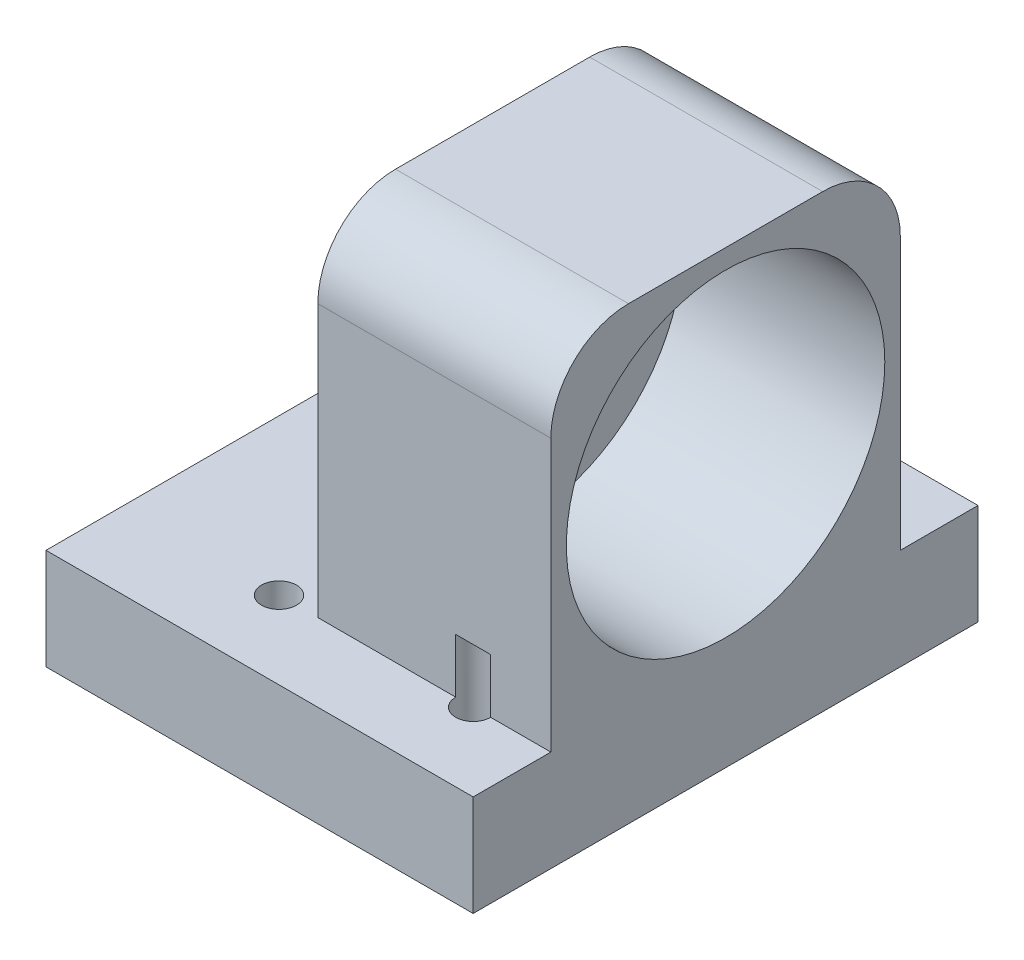
ISO-10303-21;
HEADER;
FILE_DESCRIPTION(('STEP AP214'),'2;1');
FILE_NAME('part.step','',(''),(''),'','','');
FILE_SCHEMA(('AUTOMOTIVE_DESIGN { 1 0 10303 214 1 1 1 1 }'));
ENDSEC;
DATA;
#1=APPLICATION_CONTEXT('core data for automotive mechanical design processes');
#2=APPLICATION_PROTOCOL_DEFINITION('international standard','automotive_design',2000,#1);
#3=PRODUCT_CONTEXT('',#1,'mechanical');
#4=PRODUCT('Part','Part','',(#3));
#5=PRODUCT_RELATED_PRODUCT_CATEGORY('part','',(#4));
#6=PRODUCT_DEFINITION_FORMATION('','',#4);
#7=PRODUCT_DEFINITION_CONTEXT('part definition',#1,'design');
#8=PRODUCT_DEFINITION('design','',#6,#7);
#9=PRODUCT_DEFINITION_SHAPE('','',#8);
#10=(LENGTH_UNIT() NAMED_UNIT(*) SI_UNIT(.MILLI.,.METRE.));
#11=(NAMED_UNIT(*) PLANE_ANGLE_UNIT() SI_UNIT($,.RADIAN.));
#12=(NAMED_UNIT(*) SI_UNIT($,.STERADIAN.) SOLID_ANGLE_UNIT());
#13=UNCERTAINTY_MEASURE_WITH_UNIT(LENGTH_MEASURE(1.E-05),#10,'distance_accuracy_value','');
#14=(GEOMETRIC_REPRESENTATION_CONTEXT(3) GLOBAL_UNCERTAINTY_ASSIGNED_CONTEXT((#13)) GLOBAL_UNIT_ASSIGNED_CONTEXT((#10,
#11,#12)) REPRESENTATION_CONTEXT('',''));
#15=CARTESIAN_POINT('',(0.,0.,0.));
#16=DIRECTION('',(0.,0.,1.));
#17=DIRECTION('',(1.,0.,0.));
#18=AXIS2_PLACEMENT_3D('',#15,#16,#17);
#19=CARTESIAN_POINT('',(22.5,13.,-32.5));
#20=DIRECTION('',(-1.,0.,0.));
#21=DIRECTION('',(0.,0.,1.));
#22=AXIS2_PLACEMENT_3D('',#19,#20,#21);
#23=PLANE('',#22);
#24=CARTESIAN_POINT('',(22.5,35.,0.));
#25=DIRECTION('',(1.,0.,0.));
#26=DIRECTION('',(0.,0.,-1.));
#27=AXIS2_PLACEMENT_3D('',#24,#25,#26);
#28=CIRCLE('',#27,20.5);
#29=CARTESIAN_POINT('',(22.5,35.,-20.5));
#30=VERTEX_POINT('',#29);
#31=EDGE_CURVE('E284',#30,#30,#28,.T.);
#32=ORIENTED_EDGE('',*,*,#31,.F.);
#33=EDGE_LOOP('',(#32));
#34=FACE_BOUND('',#33,.T.);
#35=DIRECTION('',(0.,-1.,0.));
#36=VECTOR('',#35,1.);
#37=CARTESIAN_POINT('',(22.5,63.,-22.5));
#38=LINE('',#37,#36);
#39=CARTESIAN_POINT('',(22.5,48.,-22.5));
#40=VERTEX_POINT('',#39);
#41=CARTESIAN_POINT('',(22.5,13.,-22.5));
#42=VERTEX_POINT('',#41);
#43=EDGE_CURVE('E308',#40,#42,#38,.T.);
#44=ORIENTED_EDGE('',*,*,#43,.F.);
#45=CARTESIAN_POINT('',(22.5,48.,-12.5));
#46=DIRECTION('',(-1.,0.,0.));
#47=DIRECTION('',(0.,0.,1.));
#48=AXIS2_PLACEMENT_3D('',#45,#46,#47);
#49=CIRCLE('',#48,10.);
#50=CARTESIAN_POINT('',(22.5,58.,-12.5));
#51=VERTEX_POINT('',#50);
#52=EDGE_CURVE('E11',#40,#51,#49,.F.);
#53=ORIENTED_EDGE('',*,*,#52,.T.);
#54=DIRECTION('',(0.,0.,-1.));
#55=VECTOR('',#54,1.);
#56=CARTESIAN_POINT('',(22.5,58.,-22.5));
#57=LINE('',#56,#55);
#58=CARTESIAN_POINT('',(22.5,58.,12.5));
#59=VERTEX_POINT('',#58);
#60=EDGE_CURVE('E168',#59,#51,#57,.T.);
#61=ORIENTED_EDGE('',*,*,#60,.F.);
#62=CARTESIAN_POINT('',(22.5,48.,12.5));
#63=DIRECTION('',(-1.,0.,0.));
#64=DIRECTION('',(0.,0.,1.));
#65=AXIS2_PLACEMENT_3D('',#62,#63,#64);
#66=CIRCLE('',#65,10.);
#67=CARTESIAN_POINT('',(22.5,48.,22.5));
#68=VERTEX_POINT('',#67);
#69=EDGE_CURVE('E209',#59,#68,#66,.F.);
#70=ORIENTED_EDGE('',*,*,#69,.T.);
#71=DIRECTION('',(0.,-1.,0.));
#72=VECTOR('',#71,1.);
#73=CARTESIAN_POINT('',(22.5,63.,22.5));
#74=LINE('',#73,#72);
#75=CARTESIAN_POINT('',(22.5,13.,22.5));
#76=VERTEX_POINT('',#75);
#77=EDGE_CURVE('E299',#68,#76,#74,.T.);
#78=ORIENTED_EDGE('',*,*,#77,.T.);
#79=DIRECTION('',(0.,0.,-1.));
#80=VECTOR('',#79,1.);
#81=CARTESIAN_POINT('',(22.5,13.,-32.5));
#82=LINE('',#81,#80);
#83=CARTESIAN_POINT('',(22.5,13.,32.5));
#84=VERTEX_POINT('',#83);
#85=EDGE_CURVE('E320',#84,#76,#82,.T.);
#86=ORIENTED_EDGE('',*,*,#85,.F.);
#87=DIRECTION('',(0.,-1.,0.));
#88=VECTOR('',#87,1.);
#89=CARTESIAN_POINT('',(22.5,13.,32.5));
#90=LINE('',#89,#88);
#91=CARTESIAN_POINT('',(22.5,0.,32.5));
#92=VERTEX_POINT('',#91);
#93=EDGE_CURVE('E343',#84,#92,#90,.T.);
#94=ORIENTED_EDGE('',*,*,#93,.T.);
#95=DIRECTION('',(0.,0.,-1.));
#96=VECTOR('',#95,1.);
#97=CARTESIAN_POINT('',(22.5,0.,-32.5));
#98=LINE('',#97,#96);
#99=CARTESIAN_POINT('',(22.5,0.,-32.5));
#100=VERTEX_POINT('',#99);
#101=EDGE_CURVE('E334',#92,#100,#98,.T.);
#102=ORIENTED_EDGE('',*,*,#101,.T.);
#103=DIRECTION('',(0.,-1.,0.));
#104=VECTOR('',#103,1.);
#105=CARTESIAN_POINT('',(22.5,13.,-32.5));
#106=LINE('',#105,#104);
#107=CARTESIAN_POINT('',(22.5,13.,-32.5));
#108=VERTEX_POINT('',#107);
#109=EDGE_CURVE('E328',#108,#100,#106,.T.);
#110=ORIENTED_EDGE('',*,*,#109,.F.);
#111=EDGE_CURVE('E319',#42,#108,#82,.T.);
#112=ORIENTED_EDGE('',*,*,#111,.F.);
#113=EDGE_LOOP('',(#44,#53,#61,#70,#78,#86,#94,#102,#110,#112));
#114=FACE_BOUND('',#113,.T.);
#115=ADVANCED_FACE('F45',(#34,#114),#23,.F.);
#116=CARTESIAN_POINT('',(22.5,63.,-22.5));
#117=DIRECTION('',(0.,0.,1.));
#118=DIRECTION('',(1.,0.,0.));
#119=AXIS2_PLACEMENT_3D('',#116,#117,#118);
#120=PLANE('',#119);
#121=DIRECTION('',(0.,-1.,0.));
#122=VECTOR('',#121,1.);
#123=CARTESIAN_POINT('',(-7.5,63.,-22.5));
#124=LINE('',#123,#122);
#125=CARTESIAN_POINT('',(-7.5,48.,-22.5));
#126=VERTEX_POINT('',#125);
#127=CARTESIAN_POINT('',(-7.5,13.,-22.5));
#128=VERTEX_POINT('',#127);
#129=EDGE_CURVE('E305',#126,#128,#124,.T.);
#130=ORIENTED_EDGE('',*,*,#129,.F.);
#131=DIRECTION('',(-1.,0.,0.));
#132=VECTOR('',#131,1.);
#133=CARTESIAN_POINT('',(22.5,48.,-22.5));
#134=LINE('',#133,#132);
#135=EDGE_CURVE('E54',#126,#40,#134,.F.);
#136=ORIENTED_EDGE('',*,*,#135,.T.);
#137=ORIENTED_EDGE('',*,*,#43,.T.);
#138=DIRECTION('',(-1.,0.,0.));
#139=VECTOR('',#138,1.);
#140=CARTESIAN_POINT('',(22.5,13.,-22.5));
#141=LINE('',#140,#139);
#142=CARTESIAN_POINT('',(14.75,13.,-22.5));
#143=VERTEX_POINT('',#142);
#144=EDGE_CURVE('E288',#42,#143,#141,.T.);
#145=ORIENTED_EDGE('',*,*,#144,.T.);
#146=DIRECTION('',(0.,-1.,0.));
#147=VECTOR('',#146,1.);
#148=CARTESIAN_POINT('',(14.75,20.,-22.5));
#149=LINE('',#148,#147);
#150=CARTESIAN_POINT('',(14.75,20.,-22.5));
#151=VERTEX_POINT('',#150);
#152=EDGE_CURVE('E184',#143,#151,#149,.F.);
#153=ORIENTED_EDGE('',*,*,#152,.T.);
#154=DIRECTION('',(1.,0.,0.));
#155=VECTOR('',#154,1.);
#156=CARTESIAN_POINT('',(22.5,20.,-22.5));
#157=LINE('',#156,#155);
#158=CARTESIAN_POINT('',(10.25,20.,-22.5));
#159=VERTEX_POINT('',#158);
#160=EDGE_CURVE('E178',#159,#151,#157,.T.);
#161=ORIENTED_EDGE('',*,*,#160,.F.);
#162=DIRECTION('',(0.,-1.,0.));
#163=VECTOR('',#162,1.);
#164=CARTESIAN_POINT('',(10.25,20.,-22.5));
#165=LINE('',#164,#163);
#166=CARTESIAN_POINT('',(10.25,13.,-22.5));
#167=VERTEX_POINT('',#166);
#168=EDGE_CURVE('E188',#159,#167,#165,.T.);
#169=ORIENTED_EDGE('',*,*,#168,.T.);
#170=EDGE_CURVE('E283',#167,#128,#141,.T.);
#171=ORIENTED_EDGE('',*,*,#170,.T.);
#172=EDGE_LOOP('',(#130,#136,#137,#145,#153,#161,#169,#171));
#173=FACE_BOUND('',#172,.T.);
#174=ADVANCED_FACE('F370',(#173),#120,.F.);
#175=CARTESIAN_POINT('',(-7.5,63.,-22.5));
#176=DIRECTION('',(1.,0.,0.));
#177=DIRECTION('',(0.,0.,-1.));
#178=AXIS2_PLACEMENT_3D('',#175,#176,#177);
#179=PLANE('',#178);
#180=CARTESIAN_POINT('',(-7.5,35.,0.));
#181=DIRECTION('',(1.,0.,0.));
#182=DIRECTION('',(0.,0.,-1.));
#183=AXIS2_PLACEMENT_3D('',#180,#181,#182);
#184=CIRCLE('',#183,7.);
#185=CARTESIAN_POINT('',(-7.5,35.,-7.));
#186=VERTEX_POINT('',#185);
#187=EDGE_CURVE('E278',#186,#186,#184,.T.);
#188=ORIENTED_EDGE('',*,*,#187,.T.);
#189=EDGE_LOOP('',(#188));
#190=FACE_BOUND('',#189,.T.);
#191=DIRECTION('',(0.,0.,1.));
#192=VECTOR('',#191,1.);
#193=CARTESIAN_POINT('',(-7.5,58.,-22.5));
#194=LINE('',#193,#192);
#195=CARTESIAN_POINT('',(-7.5,58.,-12.5));
#196=VERTEX_POINT('',#195);
#197=CARTESIAN_POINT('',(-7.5,58.,12.5));
#198=VERTEX_POINT('',#197);
#199=EDGE_CURVE('E229',#196,#198,#194,.T.);
#200=ORIENTED_EDGE('',*,*,#199,.F.);
#201=CARTESIAN_POINT('',(-7.5,48.,-12.5));
#202=DIRECTION('',(1.,0.,0.));
#203=DIRECTION('',(0.,0.,-1.));
#204=AXIS2_PLACEMENT_3D('',#201,#202,#203);
#205=CIRCLE('',#204,10.);
#206=EDGE_CURVE('E68',#196,#126,#205,.F.);
#207=ORIENTED_EDGE('',*,*,#206,.T.);
#208=ORIENTED_EDGE('',*,*,#129,.T.);
#209=DIRECTION('',(0.,0.,1.));
#210=VECTOR('',#209,1.);
#211=CARTESIAN_POINT('',(-7.5,13.,-22.5));
#212=LINE('',#211,#210);
#213=CARTESIAN_POINT('',(-7.49999999999999,13.,22.5));
#214=VERTEX_POINT('',#213);
#215=EDGE_CURVE('E292',#128,#214,#212,.T.);
#216=ORIENTED_EDGE('',*,*,#215,.T.);
#217=DIRECTION('',(0.,-1.,0.));
#218=VECTOR('',#217,1.);
#219=CARTESIAN_POINT('',(-7.49999999999999,63.,22.5));
#220=LINE('',#219,#218);
#221=CARTESIAN_POINT('',(-7.49999999999999,48.,22.5));
#222=VERTEX_POINT('',#221);
#223=EDGE_CURVE('E302',#222,#214,#220,.T.);
#224=ORIENTED_EDGE('',*,*,#223,.F.);
#225=CARTESIAN_POINT('',(-7.49999999999999,48.,12.5));
#226=DIRECTION('',(1.,0.,0.));
#227=DIRECTION('',(0.,0.,-1.));
#228=AXIS2_PLACEMENT_3D('',#225,#226,#227);
#229=CIRCLE('',#228,10.);
#230=EDGE_CURVE('E215',#222,#198,#229,.F.);
#231=ORIENTED_EDGE('',*,*,#230,.T.);
#232=EDGE_LOOP('',(#200,#207,#208,#216,#224,#231));
#233=FACE_BOUND('',#232,.T.);
#234=ADVANCED_FACE('F233',(#190,#233),#179,.F.);
#235=CARTESIAN_POINT('',(22.5,63.,22.5));
#236=DIRECTION('',(0.,0.,-1.));
#237=DIRECTION('',(-1.,0.,0.));
#238=AXIS2_PLACEMENT_3D('',#235,#236,#237);
#239=PLANE('',#238);
#240=ORIENTED_EDGE('',*,*,#77,.F.);
#241=DIRECTION('',(1.,0.,0.));
#242=VECTOR('',#241,1.);
#243=CARTESIAN_POINT('',(-7.49999999999999,48.,22.5));
#244=LINE('',#243,#242);
#245=EDGE_CURVE('E212',#68,#222,#244,.F.);
#246=ORIENTED_EDGE('',*,*,#245,.T.);
#247=ORIENTED_EDGE('',*,*,#223,.T.);
#248=DIRECTION('',(1.,0.,0.));
#249=VECTOR('',#248,1.);
#250=CARTESIAN_POINT('',(22.5,13.,22.5));
#251=LINE('',#250,#249);
#252=CARTESIAN_POINT('',(10.25,13.,22.5));
#253=VERTEX_POINT('',#252);
#254=EDGE_CURVE('E174',#214,#253,#251,.T.);
#255=ORIENTED_EDGE('',*,*,#254,.T.);
#256=DIRECTION('',(0.,-1.,0.));
#257=VECTOR('',#256,1.);
#258=CARTESIAN_POINT('',(10.25,20.,22.5));
#259=LINE('',#258,#257);
#260=CARTESIAN_POINT('',(10.25,20.,22.5));
#261=VERTEX_POINT('',#260);
#262=EDGE_CURVE('E159',#253,#261,#259,.F.);
#263=ORIENTED_EDGE('',*,*,#262,.T.);
#264=DIRECTION('',(-1.,0.,0.));
#265=VECTOR('',#264,1.);
#266=CARTESIAN_POINT('',(22.5,20.,22.5));
#267=LINE('',#266,#265);
#268=CARTESIAN_POINT('',(14.75,20.,22.5));
#269=VERTEX_POINT('',#268);
#270=EDGE_CURVE('E150',#269,#261,#267,.T.);
#271=ORIENTED_EDGE('',*,*,#270,.F.);
#272=DIRECTION('',(0.,-1.,0.));
#273=VECTOR('',#272,1.);
#274=CARTESIAN_POINT('',(14.75,20.,22.5));
#275=LINE('',#274,#273);
#276=CARTESIAN_POINT('',(14.75,13.,22.5));
#277=VERTEX_POINT('',#276);
#278=EDGE_CURVE('E165',#269,#277,#275,.T.);
#279=ORIENTED_EDGE('',*,*,#278,.T.);
#280=EDGE_CURVE('E296',#277,#76,#251,.T.);
#281=ORIENTED_EDGE('',*,*,#280,.T.);
#282=EDGE_LOOP('',(#240,#246,#247,#255,#263,#271,#279,#281));
#283=FACE_BOUND('',#282,.T.);
#284=ADVANCED_FACE('F172',(#283),#239,.F.);
#285=CARTESIAN_POINT('',(-32.5,13.,-32.5));
#286=DIRECTION('',(1.,0.,0.));
#287=DIRECTION('',(0.,0.,-1.));
#288=AXIS2_PLACEMENT_3D('',#285,#286,#287);
#289=PLANE('',#288);
#290=DIRECTION('',(0.,0.,1.));
#291=VECTOR('',#290,1.);
#292=CARTESIAN_POINT('',(-32.5,13.,-32.5));
#293=LINE('',#292,#291);
#294=CARTESIAN_POINT('',(-32.5,13.,-22.5));
#295=VERTEX_POINT('',#294);
#296=CARTESIAN_POINT('',(-32.5,13.,32.5));
#297=VERTEX_POINT('',#296);
#298=EDGE_CURVE('E312',#295,#297,#293,.T.);
#299=ORIENTED_EDGE('',*,*,#298,.F.);
#300=DIRECTION('',(0.,-1.,0.));
#301=VECTOR('',#300,1.);
#302=CARTESIAN_POINT('',(-32.5,13.,-22.5));
#303=LINE('',#302,#301);
#304=CARTESIAN_POINT('',(-32.5,0.,-22.5));
#305=VERTEX_POINT('',#304);
#306=EDGE_CURVE('E192',#295,#305,#303,.T.);
#307=ORIENTED_EDGE('',*,*,#306,.T.);
#308=DIRECTION('',(0.,0.,1.));
#309=VECTOR('',#308,1.);
#310=CARTESIAN_POINT('',(-32.5,0.,-32.5));
#311=LINE('',#310,#309);
#312=CARTESIAN_POINT('',(-32.5,0.,32.5));
#313=VERTEX_POINT('',#312);
#314=EDGE_CURVE('E311',#305,#313,#311,.T.);
#315=ORIENTED_EDGE('',*,*,#314,.T.);
#316=DIRECTION('',(0.,-1.,0.));
#317=VECTOR('',#316,1.);
#318=CARTESIAN_POINT('',(-32.5,13.,32.5));
#319=LINE('',#318,#317);
#320=EDGE_CURVE('E160',#297,#313,#319,.T.);
#321=ORIENTED_EDGE('',*,*,#320,.F.);
#322=EDGE_LOOP('',(#299,#307,#315,#321));
#323=FACE_BOUND('',#322,.T.);
#324=ADVANCED_FACE('F387',(#323),#289,.F.);
#325=CARTESIAN_POINT('',(-32.5,13.,32.5));
#326=DIRECTION('',(0.,0.,-1.));
#327=DIRECTION('',(-1.,0.,0.));
#328=AXIS2_PLACEMENT_3D('',#325,#326,#327);
#329=PLANE('',#328);
#330=DIRECTION('',(1.,0.,0.));
#331=VECTOR('',#330,1.);
#332=CARTESIAN_POINT('',(-32.5,0.,32.5));
#333=LINE('',#332,#331);
#334=EDGE_CURVE('E331',#313,#92,#333,.T.);
#335=ORIENTED_EDGE('',*,*,#334,.T.);
#336=ORIENTED_EDGE('',*,*,#93,.F.);
#337=DIRECTION('',(1.,0.,0.));
#338=VECTOR('',#337,1.);
#339=CARTESIAN_POINT('',(-32.5,13.,32.5));
#340=LINE('',#339,#338);
#341=EDGE_CURVE('E315',#297,#84,#340,.T.);
#342=ORIENTED_EDGE('',*,*,#341,.F.);
#343=ORIENTED_EDGE('',*,*,#320,.T.);
#344=EDGE_LOOP('',(#335,#336,#342,#343));
#345=FACE_BOUND('',#344,.T.);
#346=ADVANCED_FACE('F384',(#345),#329,.F.);
#347=CARTESIAN_POINT('',(-32.5,13.,-32.5));
#348=DIRECTION('',(0.,0.,1.));
#349=DIRECTION('',(1.,0.,0.));
#350=AXIS2_PLACEMENT_3D('',#347,#348,#349);
#351=PLANE('',#350);
#352=DIRECTION('',(-1.,0.,0.));
#353=VECTOR('',#352,1.);
#354=CARTESIAN_POINT('',(-32.5,0.,-32.5));
#355=LINE('',#354,#353);
#356=CARTESIAN_POINT('',(-22.5,0.,-32.5));
#357=VERTEX_POINT('',#356);
#358=EDGE_CURVE('E316',#100,#357,#355,.T.);
#359=ORIENTED_EDGE('',*,*,#358,.T.);
#360=DIRECTION('',(0.,-1.,0.));
#361=VECTOR('',#360,1.);
#362=CARTESIAN_POINT('',(-22.5,13.,-32.5));
#363=LINE('',#362,#361);
#364=CARTESIAN_POINT('',(-22.5,13.,-32.5));
#365=VERTEX_POINT('',#364);
#366=EDGE_CURVE('E199',#357,#365,#363,.F.);
#367=ORIENTED_EDGE('',*,*,#366,.T.);
#368=DIRECTION('',(-1.,0.,0.));
#369=VECTOR('',#368,1.);
#370=CARTESIAN_POINT('',(-32.5,13.,-32.5));
#371=LINE('',#370,#369);
#372=EDGE_CURVE('E324',#108,#365,#371,.T.);
#373=ORIENTED_EDGE('',*,*,#372,.F.);
#374=ORIENTED_EDGE('',*,*,#109,.T.);
#375=EDGE_LOOP('',(#359,#367,#373,#374));
#376=FACE_BOUND('',#375,.T.);
#377=ADVANCED_FACE('F382',(#376),#351,.F.);
#378=CARTESIAN_POINT('',(0.,13.,0.));
#379=DIRECTION('',(0.,1.,0.));
#380=DIRECTION('',(0.,0.,1.));
#381=AXIS2_PLACEMENT_3D('',#378,#379,#380);
#382=PLANE('',#381);
#383=ORIENTED_EDGE('',*,*,#372,.T.);
#384=CARTESIAN_POINT('',(-22.5,13.,-22.5));
#385=DIRECTION('',(0.,1.,0.));
#386=DIRECTION('',(0.,0.,1.));
#387=AXIS2_PLACEMENT_3D('',#384,#385,#386);
#388=CIRCLE('',#387,10.);
#389=EDGE_CURVE('E202',#365,#295,#388,.T.);
#390=ORIENTED_EDGE('',*,*,#389,.T.);
#391=ORIENTED_EDGE('',*,*,#298,.T.);
#392=ORIENTED_EDGE('',*,*,#341,.T.);
#393=ORIENTED_EDGE('',*,*,#85,.T.);
#394=ORIENTED_EDGE('',*,*,#280,.F.);
#395=CARTESIAN_POINT('',(12.5,13.,22.5));
#396=DIRECTION('',(0.,1.,0.));
#397=DIRECTION('',(0.,0.,1.));
#398=AXIS2_PLACEMENT_3D('',#395,#396,#397);
#399=CIRCLE('',#398,2.25);
#400=EDGE_CURVE('E260',#253,#277,#399,.T.);
#401=ORIENTED_EDGE('',*,*,#400,.F.);
#402=ORIENTED_EDGE('',*,*,#254,.F.);
#403=ORIENTED_EDGE('',*,*,#215,.F.);
#404=ORIENTED_EDGE('',*,*,#170,.F.);
#405=CARTESIAN_POINT('',(12.5,13.,-22.5));
#406=DIRECTION('',(0.,1.,0.));
#407=DIRECTION('',(0.,0.,1.));
#408=AXIS2_PLACEMENT_3D('',#405,#406,#407);
#409=CIRCLE('',#408,2.25);
#410=EDGE_CURVE('E263',#143,#167,#409,.T.);
#411=ORIENTED_EDGE('',*,*,#410,.F.);
#412=ORIENTED_EDGE('',*,*,#144,.F.);
#413=ORIENTED_EDGE('',*,*,#111,.T.);
#414=EDGE_LOOP('',(#383,#390,#391,#392,#393,#394,#401,#402,#403,#404,#411,#412,#413));
#415=FACE_BOUND('',#414,.T.);
#416=CARTESIAN_POINT('',(-12.5,13.,-22.5));
#417=DIRECTION('',(0.,1.,0.));
#418=DIRECTION('',(0.,0.,1.));
#419=AXIS2_PLACEMENT_3D('',#416,#417,#418);
#420=CIRCLE('',#419,2.25);
#421=CARTESIAN_POINT('',(-12.5,13.,-20.25));
#422=VERTEX_POINT('',#421);
#423=EDGE_CURVE('E270',#422,#422,#420,.T.);
#424=ORIENTED_EDGE('',*,*,#423,.F.);
#425=EDGE_LOOP('',(#424));
#426=FACE_BOUND('',#425,.T.);
#427=CARTESIAN_POINT('',(-12.5,13.,22.5));
#428=DIRECTION('',(0.,1.,0.));
#429=DIRECTION('',(0.,0.,1.));
#430=AXIS2_PLACEMENT_3D('',#427,#428,#429);
#431=CIRCLE('',#430,2.25);
#432=CARTESIAN_POINT('',(-12.5,13.,24.75));
#433=VERTEX_POINT('',#432);
#434=EDGE_CURVE('E266',#433,#433,#431,.T.);
#435=ORIENTED_EDGE('',*,*,#434,.F.);
#436=EDGE_LOOP('',(#435));
#437=FACE_BOUND('',#436,.T.);
#438=ADVANCED_FACE('F410',(#415,#426,#437),#382,.T.);
#439=CARTESIAN_POINT('',(0.,0.,0.));
#440=DIRECTION('',(0.,1.,0.));
#441=DIRECTION('',(0.,0.,1.));
#442=AXIS2_PLACEMENT_3D('',#439,#440,#441);
#443=PLANE('',#442);
#444=CARTESIAN_POINT('',(12.5,0.,22.5));
#445=DIRECTION('',(0.,-1.,0.));
#446=DIRECTION('',(0.,0.,-1.));
#447=AXIS2_PLACEMENT_3D('',#444,#445,#446);
#448=CIRCLE('',#447,2.25);
#449=CARTESIAN_POINT('',(12.5,0.,20.25));
#450=VERTEX_POINT('',#449);
#451=EDGE_CURVE('E167',#450,#450,#448,.T.);
#452=ORIENTED_EDGE('',*,*,#451,.F.);
#453=EDGE_LOOP('',(#452));
#454=FACE_BOUND('',#453,.T.);
#455=CARTESIAN_POINT('',(12.5,0.,-22.5));
#456=DIRECTION('',(0.,-1.,0.));
#457=DIRECTION('',(0.,0.,-1.));
#458=AXIS2_PLACEMENT_3D('',#455,#456,#457);
#459=CIRCLE('',#458,2.25);
#460=CARTESIAN_POINT('',(12.5,0.,-24.75));
#461=VERTEX_POINT('',#460);
#462=EDGE_CURVE('E247',#461,#461,#459,.T.);
#463=ORIENTED_EDGE('',*,*,#462,.F.);
#464=EDGE_LOOP('',(#463));
#465=FACE_BOUND('',#464,.T.);
#466=CARTESIAN_POINT('',(-12.5,0.,-22.5));
#467=DIRECTION('',(0.,-1.,0.));
#468=DIRECTION('',(0.,0.,-1.));
#469=AXIS2_PLACEMENT_3D('',#466,#467,#468);
#470=CIRCLE('',#469,2.25);
#471=CARTESIAN_POINT('',(-12.5,0.,-24.75));
#472=VERTEX_POINT('',#471);
#473=EDGE_CURVE('E242',#472,#472,#470,.T.);
#474=ORIENTED_EDGE('',*,*,#473,.F.);
#475=EDGE_LOOP('',(#474));
#476=FACE_BOUND('',#475,.T.);
#477=CARTESIAN_POINT('',(-12.5,0.,22.5));
#478=DIRECTION('',(0.,-1.,0.));
#479=DIRECTION('',(0.,0.,-1.));
#480=AXIS2_PLACEMENT_3D('',#477,#478,#479);
#481=CIRCLE('',#480,2.25);
#482=CARTESIAN_POINT('',(-12.5,0.,20.25));
#483=VERTEX_POINT('',#482);
#484=EDGE_CURVE('E246',#483,#483,#481,.T.);
#485=ORIENTED_EDGE('',*,*,#484,.F.);
#486=EDGE_LOOP('',(#485));
#487=FACE_BOUND('',#486,.T.);
#488=ORIENTED_EDGE('',*,*,#314,.F.);
#489=CARTESIAN_POINT('',(-22.5,0.,-22.5));
#490=DIRECTION('',(0.,1.,0.));
#491=DIRECTION('',(0.,0.,1.));
#492=AXIS2_PLACEMENT_3D('',#489,#490,#491);
#493=CIRCLE('',#492,10.);
#494=EDGE_CURVE('E196',#305,#357,#493,.F.);
#495=ORIENTED_EDGE('',*,*,#494,.T.);
#496=ORIENTED_EDGE('',*,*,#358,.F.);
#497=ORIENTED_EDGE('',*,*,#101,.F.);
#498=ORIENTED_EDGE('',*,*,#334,.F.);
#499=EDGE_LOOP('',(#488,#495,#496,#497,#498));
#500=FACE_BOUND('',#499,.T.);
#501=ADVANCED_FACE('F519',(#454,#465,#476,#487,#500),#443,.F.);
#502=CARTESIAN_POINT('',(-3.5,35.,0.));
#503=DIRECTION('',(1.,0.,0.));
#504=DIRECTION('',(0.,0.,-1.));
#505=AXIS2_PLACEMENT_3D('',#502,#503,#504);
#506=CYLINDRICAL_SURFACE('',#505,20.5);
#507=CARTESIAN_POINT('',(-3.5,35.,0.));
#508=DIRECTION('',(1.,0.,0.));
#509=DIRECTION('',(0.,0.,-1.));
#510=AXIS2_PLACEMENT_3D('',#507,#508,#509);
#511=CIRCLE('',#510,20.5);
#512=CARTESIAN_POINT('',(-3.5,35.,-20.5));
#513=VERTEX_POINT('',#512);
#514=EDGE_CURVE('E279',#513,#513,#511,.T.);
#515=CARTESIAN_POINT('',(-3.5,35.,-20.5));
#516=CARTESIAN_POINT('',(-3.22916666666667,35.,-20.5));
#517=CARTESIAN_POINT('',(-2.95833333333333,35.,-20.5));
#518=CARTESIAN_POINT('',(-2.41666666666667,35.,-20.5));
#519=CARTESIAN_POINT('',(-2.14583333333333,35.,-20.5));
#520=CARTESIAN_POINT('',(-1.60416666666667,35.,-20.5));
#521=CARTESIAN_POINT('',(-1.33333333333333,35.,-20.5));
#522=CARTESIAN_POINT('',(-0.791666666666666,35.,-20.5));
#523=CARTESIAN_POINT('',(-0.520833333333333,35.,-20.5));
#524=CARTESIAN_POINT('',(0.0208333333333333,35.,-20.5));
#525=CARTESIAN_POINT('',(0.291666666666666,35.,-20.5));
#526=CARTESIAN_POINT('',(0.833333333333333,35.,-20.5));
#527=CARTESIAN_POINT('',(1.10416666666667,35.,-20.5));
#528=CARTESIAN_POINT('',(1.64583333333333,35.,-20.5));
#529=CARTESIAN_POINT('',(1.91666666666667,35.,-20.5));
#530=CARTESIAN_POINT('',(2.45833333333333,35.,-20.5));
#531=CARTESIAN_POINT('',(2.72916666666667,35.,-20.5));
#532=CARTESIAN_POINT('',(3.27083333333333,35.,-20.5));
#533=CARTESIAN_POINT('',(3.54166666666667,35.,-20.5));
#534=CARTESIAN_POINT('',(4.08333333333333,35.,-20.5));
#535=CARTESIAN_POINT('',(4.35416666666667,35.,-20.5));
#536=CARTESIAN_POINT('',(4.89583333333333,35.,-20.5));
#537=CARTESIAN_POINT('',(5.16666666666667,35.,-20.5));
#538=CARTESIAN_POINT('',(5.70833333333333,35.,-20.5));
#539=CARTESIAN_POINT('',(5.97916666666667,35.,-20.5));
#540=CARTESIAN_POINT('',(6.52083333333333,35.,-20.5));
#541=CARTESIAN_POINT('',(6.79166666666667,35.,-20.5));
#542=CARTESIAN_POINT('',(7.33333333333333,35.,-20.5));
#543=CARTESIAN_POINT('',(7.60416666666667,35.,-20.5));
#544=CARTESIAN_POINT('',(8.14583333333333,35.,-20.5));
#545=CARTESIAN_POINT('',(8.41666666666667,35.,-20.5));
#546=CARTESIAN_POINT('',(8.95833333333333,35.,-20.5));
#547=CARTESIAN_POINT('',(9.22916666666667,35.,-20.5));
#548=CARTESIAN_POINT('',(9.77083333333333,35.,-20.5));
#549=CARTESIAN_POINT('',(10.0416666666667,35.,-20.5));
#550=CARTESIAN_POINT('',(10.5833333333333,35.,-20.5));
#551=CARTESIAN_POINT('',(10.8541666666667,35.,-20.5));
#552=CARTESIAN_POINT('',(11.3958333333333,35.,-20.5));
#553=CARTESIAN_POINT('',(11.6666666666667,35.,-20.5));
#554=CARTESIAN_POINT('',(12.2083333333333,35.,-20.5));
#555=CARTESIAN_POINT('',(12.4791666666667,35.,-20.5));
#556=CARTESIAN_POINT('',(13.0208333333333,35.,-20.5));
#557=CARTESIAN_POINT('',(13.2916666666667,35.,-20.5));
#558=CARTESIAN_POINT('',(13.8333333333333,35.,-20.5));
#559=CARTESIAN_POINT('',(14.1041666666667,35.,-20.5));
#560=CARTESIAN_POINT('',(14.6458333333333,35.,-20.5));
#561=CARTESIAN_POINT('',(14.9166666666667,35.,-20.5));
#562=CARTESIAN_POINT('',(15.4583333333333,35.,-20.5));
#563=CARTESIAN_POINT('',(15.7291666666667,35.,-20.5));
#564=CARTESIAN_POINT('',(16.2708333333333,35.,-20.5));
#565=CARTESIAN_POINT('',(16.5416666666667,35.,-20.5));
#566=CARTESIAN_POINT('',(17.0833333333333,35.,-20.5));
#567=CARTESIAN_POINT('',(17.3541666666667,35.,-20.5));
#568=CARTESIAN_POINT('',(17.8958333333333,35.,-20.5));
#569=CARTESIAN_POINT('',(18.1666666666667,35.,-20.5));
#570=CARTESIAN_POINT('',(18.7083333333333,35.,-20.5));
#571=CARTESIAN_POINT('',(18.9791666666667,35.,-20.5));
#572=CARTESIAN_POINT('',(19.5208333333333,35.,-20.5));
#573=CARTESIAN_POINT('',(19.7916666666667,35.,-20.5));
#574=CARTESIAN_POINT('',(20.3333333333333,35.,-20.5));
#575=CARTESIAN_POINT('',(20.6041666666667,35.,-20.5));
#576=CARTESIAN_POINT('',(21.1458333333333,35.,-20.5));
#577=CARTESIAN_POINT('',(21.4166666666667,35.,-20.5));
#578=CARTESIAN_POINT('',(21.9583333333333,35.,-20.5));
#579=CARTESIAN_POINT('',(22.2291666666667,35.,-20.5));
#580=CARTESIAN_POINT('',(22.5,35.,-20.5));
#581=B_SPLINE_CURVE_WITH_KNOTS('',3,(#515,#516,#517,#518,#519,#520,#521,#522,#523,#524,#525,
#526,#527,#528,#529,#530,#531,#532,#533,#534,#535,#536,#537,#538,#539,#540,#541,#542,#543,#544,
#545,#546,#547,#548,#549,#550,#551,#552,#553,#554,#555,#556,#557,#558,#559,#560,#561,#562,#563,
#564,#565,#566,#567,#568,#569,#570,#571,#572,#573,#574,#575,#576,#577,#578,#579,#580),
.UNSPECIFIED.,.F.,.F.,(4,2,2,2,2,2,2,2,2,2,2,2,2,2,2,2,2,2,2,2,2,2,2,2,2,2,2,2,2,2,2,2,4),(0.,
0.8125,1.625,2.4375,3.25,4.0625,4.875,5.6875,6.5,7.3125,8.125,8.9375,9.75,10.5625,11.375,
12.1875,13.,13.8125,14.625,15.4375,16.25,17.0625,17.875,18.6875,19.5,20.3125,21.125,21.9375,
22.75,23.5625,24.375,25.1875,26.),.UNSPECIFIED.);
#582=EDGE_CURVE('BSEAM365',#513,#30,#581,.T.);
#583=ORIENTED_EDGE('',*,*,#514,.F.);
#584=ORIENTED_EDGE('',*,*,#31,.T.);
#585=ORIENTED_EDGE('',*,*,#582,.T.);
#586=ORIENTED_EDGE('',*,*,#582,.F.);
#587=EDGE_LOOP('',(#583,#585,#584,#586));
#588=FACE_BOUND('',#587,.T.);
#589=ADVANCED_FACE('F365',(#588),#506,.F.);
#590=CARTESIAN_POINT('',(-3.5,35.,0.));
#591=DIRECTION('',(1.,0.,0.));
#592=DIRECTION('',(0.,0.,-1.));
#593=AXIS2_PLACEMENT_3D('',#590,#591,#592);
#594=PLANE('',#593);
#595=CARTESIAN_POINT('',(-3.5,35.,0.));
#596=DIRECTION('',(1.,0.,0.));
#597=DIRECTION('',(0.,0.,-1.));
#598=AXIS2_PLACEMENT_3D('',#595,#596,#597);
#599=CIRCLE('',#598,7.);
#600=CARTESIAN_POINT('',(-3.5,35.,-7.));
#601=VERTEX_POINT('',#600);
#602=EDGE_CURVE('E274',#601,#601,#599,.T.);
#603=ORIENTED_EDGE('',*,*,#602,.F.);
#604=EDGE_LOOP('',(#603));
#605=FACE_BOUND('',#604,.T.);
#606=ORIENTED_EDGE('',*,*,#514,.T.);
#607=EDGE_LOOP('',(#606));
#608=FACE_BOUND('',#607,.T.);
#609=ADVANCED_FACE('F356',(#605,#608),#594,.T.);
#610=CARTESIAN_POINT('',(-23.5,35.,0.));
#611=DIRECTION('',(1.,0.,0.));
#612=DIRECTION('',(0.,0.,-1.));
#613=AXIS2_PLACEMENT_3D('',#610,#611,#612);
#614=CYLINDRICAL_SURFACE('',#613,7.);
#615=ORIENTED_EDGE('',*,*,#602,.T.);
#616=EDGE_LOOP('',(#615));
#617=FACE_BOUND('',#616,.T.);
#618=ORIENTED_EDGE('',*,*,#187,.F.);
#619=EDGE_LOOP('',(#618));
#620=FACE_BOUND('',#619,.T.);
#621=ADVANCED_FACE('F354',(#617,#620),#614,.F.);
#622=CARTESIAN_POINT('',(12.5,20.,22.5));
#623=DIRECTION('',(0.,-1.,0.));
#624=DIRECTION('',(0.,0.,-1.));
#625=AXIS2_PLACEMENT_3D('',#622,#623,#624);
#626=CYLINDRICAL_SURFACE('',#625,2.25);
#627=ORIENTED_EDGE('',*,*,#451,.T.);
#628=EDGE_LOOP('',(#627));
#629=FACE_BOUND('',#628,.T.);
#630=CARTESIAN_POINT('',(12.5,20.,22.5));
#631=DIRECTION('',(0.,-1.,0.));
#632=DIRECTION('',(0.,0.,-1.));
#633=AXIS2_PLACEMENT_3D('',#630,#631,#632);
#634=CIRCLE('',#633,2.25);
#635=EDGE_CURVE('E153',#261,#269,#634,.T.);
#636=ORIENTED_EDGE('',*,*,#635,.F.);
#637=ORIENTED_EDGE('',*,*,#262,.F.);
#638=ORIENTED_EDGE('',*,*,#400,.T.);
#639=ORIENTED_EDGE('',*,*,#278,.F.);
#640=EDGE_LOOP('',(#636,#637,#638,#639));
#641=FACE_BOUND('',#640,.T.);
#642=ADVANCED_FACE('F163',(#629,#641),#626,.F.);
#643=CARTESIAN_POINT('',(12.5,20.,22.5));
#644=DIRECTION('',(0.,-1.,0.));
#645=DIRECTION('',(0.,0.,-1.));
#646=AXIS2_PLACEMENT_3D('',#643,#644,#645);
#647=PLANE('',#646);
#648=ORIENTED_EDGE('',*,*,#270,.T.);
#649=ORIENTED_EDGE('',*,*,#635,.T.);
#650=EDGE_LOOP('',(#648,#649));
#651=FACE_BOUND('',#650,.T.);
#652=ADVANCED_FACE('F152',(#651),#647,.T.);
#653=CARTESIAN_POINT('',(12.5,20.,-22.5));
#654=DIRECTION('',(0.,-1.,0.));
#655=DIRECTION('',(0.,0.,-1.));
#656=AXIS2_PLACEMENT_3D('',#653,#654,#655);
#657=CYLINDRICAL_SURFACE('',#656,2.25);
#658=ORIENTED_EDGE('',*,*,#462,.T.);
#659=EDGE_LOOP('',(#658));
#660=FACE_BOUND('',#659,.T.);
#661=CARTESIAN_POINT('',(12.5,20.,-22.5));
#662=DIRECTION('',(0.,-1.,0.));
#663=DIRECTION('',(0.,0.,-1.));
#664=AXIS2_PLACEMENT_3D('',#661,#662,#663);
#665=CIRCLE('',#664,2.25);
#666=EDGE_CURVE('E251',#151,#159,#665,.T.);
#667=ORIENTED_EDGE('',*,*,#666,.F.);
#668=ORIENTED_EDGE('',*,*,#152,.F.);
#669=ORIENTED_EDGE('',*,*,#410,.T.);
#670=ORIENTED_EDGE('',*,*,#168,.F.);
#671=EDGE_LOOP('',(#667,#668,#669,#670));
#672=FACE_BOUND('',#671,.T.);
#673=ADVANCED_FACE('F418',(#660,#672),#657,.F.);
#674=CARTESIAN_POINT('',(12.5,20.,-22.5));
#675=DIRECTION('',(0.,-1.,0.));
#676=DIRECTION('',(0.,0.,-1.));
#677=AXIS2_PLACEMENT_3D('',#674,#675,#676);
#678=PLANE('',#677);
#679=ORIENTED_EDGE('',*,*,#160,.T.);
#680=ORIENTED_EDGE('',*,*,#666,.T.);
#681=EDGE_LOOP('',(#679,#680));
#682=FACE_BOUND('',#681,.T.);
#683=ADVANCED_FACE('F421',(#682),#678,.T.);
#684=CARTESIAN_POINT('',(-12.5,20.,22.5));
#685=DIRECTION('',(0.,-1.,0.));
#686=DIRECTION('',(0.,0.,-1.));
#687=AXIS2_PLACEMENT_3D('',#684,#685,#686);
#688=CYLINDRICAL_SURFACE('',#687,2.25);
#689=ORIENTED_EDGE('',*,*,#434,.T.);
#690=EDGE_LOOP('',(#689));
#691=FACE_BOUND('',#690,.T.);
#692=ORIENTED_EDGE('',*,*,#484,.T.);
#693=EDGE_LOOP('',(#692));
#694=FACE_BOUND('',#693,.T.);
#695=ADVANCED_FACE('F423',(#691,#694),#688,.F.);
#696=CARTESIAN_POINT('',(-12.5,20.,-22.5));
#697=DIRECTION('',(0.,-1.,0.));
#698=DIRECTION('',(0.,0.,-1.));
#699=AXIS2_PLACEMENT_3D('',#696,#697,#698);
#700=CYLINDRICAL_SURFACE('',#699,2.25);
#701=ORIENTED_EDGE('',*,*,#423,.T.);
#702=EDGE_LOOP('',(#701));
#703=FACE_BOUND('',#702,.T.);
#704=ORIENTED_EDGE('',*,*,#473,.T.);
#705=EDGE_LOOP('',(#704));
#706=FACE_BOUND('',#705,.T.);
#707=ADVANCED_FACE('F394',(#703,#706),#700,.F.);
#708=CARTESIAN_POINT('',(-22.5,13.,-22.5));
#709=DIRECTION('',(0.,-1.,0.));
#710=DIRECTION('',(0.,0.,-1.));
#711=AXIS2_PLACEMENT_3D('',#708,#709,#710);
#712=CYLINDRICAL_SURFACE('',#711,10.);
#713=ORIENTED_EDGE('',*,*,#389,.F.);
#714=ORIENTED_EDGE('',*,*,#366,.F.);
#715=ORIENTED_EDGE('',*,*,#494,.F.);
#716=ORIENTED_EDGE('',*,*,#306,.F.);
#717=EDGE_LOOP('',(#713,#714,#715,#716));
#718=FACE_BOUND('',#717,.T.);
#719=ADVANCED_FACE('F392',(#718),#712,.T.);
#720=CARTESIAN_POINT('',(0.,58.,0.));
#721=DIRECTION('',(0.,1.,0.));
#722=DIRECTION('',(0.,0.,1.));
#723=AXIS2_PLACEMENT_3D('',#720,#721,#722);
#724=PLANE('',#723);
#725=ORIENTED_EDGE('',*,*,#60,.T.);
#726=DIRECTION('',(-1.,0.,0.));
#727=VECTOR('',#726,1.);
#728=CARTESIAN_POINT('',(-7.5,58.,-12.5));
#729=LINE('',#728,#727);
#730=EDGE_CURVE('E219',#51,#196,#729,.T.);
#731=ORIENTED_EDGE('',*,*,#730,.T.);
#732=ORIENTED_EDGE('',*,*,#199,.T.);
#733=DIRECTION('',(1.,0.,0.));
#734=VECTOR('',#733,1.);
#735=CARTESIAN_POINT('',(22.5,58.,12.5));
#736=LINE('',#735,#734);
#737=EDGE_CURVE('E205',#198,#59,#736,.T.);
#738=ORIENTED_EDGE('',*,*,#737,.T.);
#739=EDGE_LOOP('',(#725,#731,#732,#738));
#740=FACE_BOUND('',#739,.T.);
#741=ADVANCED_FACE('F228',(#740),#724,.T.);
#742=CARTESIAN_POINT('',(0.,48.,12.5));
#743=DIRECTION('',(-1.,0.,0.));
#744=DIRECTION('',(0.,0.,1.));
#745=AXIS2_PLACEMENT_3D('',#742,#743,#744);
#746=CYLINDRICAL_SURFACE('',#745,10.);
#747=ORIENTED_EDGE('',*,*,#230,.F.);
#748=ORIENTED_EDGE('',*,*,#245,.F.);
#749=ORIENTED_EDGE('',*,*,#69,.F.);
#750=ORIENTED_EDGE('',*,*,#737,.F.);
#751=EDGE_LOOP('',(#747,#748,#749,#750));
#752=FACE_BOUND('',#751,.T.);
#753=ADVANCED_FACE('F396',(#752),#746,.T.);
#754=CARTESIAN_POINT('',(0.,48.,-12.5));
#755=DIRECTION('',(1.,0.,0.));
#756=DIRECTION('',(0.,0.,-1.));
#757=AXIS2_PLACEMENT_3D('',#754,#755,#756);
#758=CYLINDRICAL_SURFACE('',#757,10.);
#759=ORIENTED_EDGE('',*,*,#52,.F.);
#760=ORIENTED_EDGE('',*,*,#135,.F.);
#761=ORIENTED_EDGE('',*,*,#206,.F.);
#762=ORIENTED_EDGE('',*,*,#730,.F.);
#763=EDGE_LOOP('',(#759,#760,#761,#762));
#764=FACE_BOUND('',#763,.T.);
#765=ADVANCED_FACE('F47',(#764),#758,.T.);
#766=CLOSED_SHELL('',(#115,#174,#234,#284,#324,#346,#377,#438,#501,#589,#609,#621,#642,#652,
#673,#683,#695,#707,#719,#741,#753,#765));
#767=MANIFOLD_SOLID_BREP('B2',#766);
#768=ADVANCED_BREP_SHAPE_REPRESENTATION('',(#18,#767),#14);
#769=SHAPE_DEFINITION_REPRESENTATION(#9,#768);
ENDSEC;
END-ISO-10303-21;
